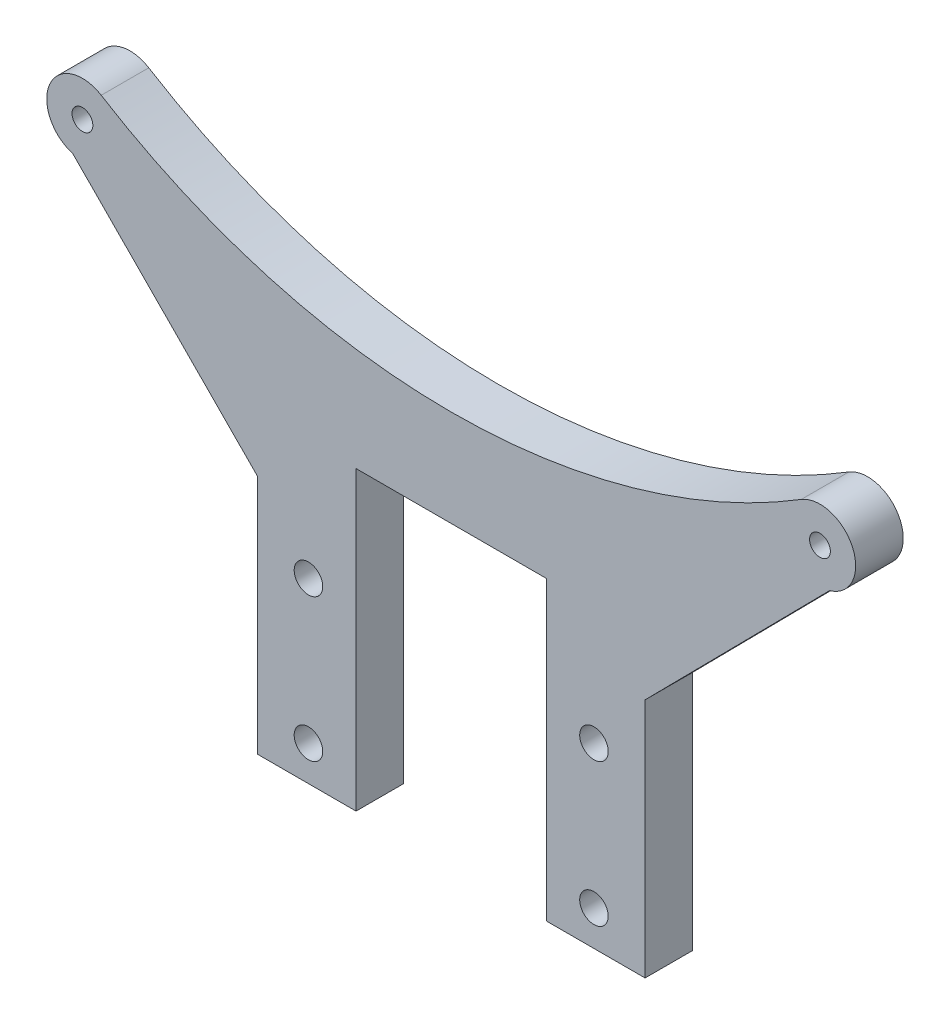
ISO-10303-21;
HEADER;
FILE_DESCRIPTION(('STEP AP214'),'2;1');
FILE_NAME('part.step','',(''),(''),'','','');
FILE_SCHEMA(('AUTOMOTIVE_DESIGN { 1 0 10303 214 1 1 1 1 }'));
ENDSEC;
DATA;
#1=APPLICATION_CONTEXT('core data for automotive mechanical design processes');
#2=APPLICATION_PROTOCOL_DEFINITION('international standard','automotive_design',2000,#1);
#3=PRODUCT_CONTEXT('',#1,'mechanical');
#4=PRODUCT('Part','Part','',(#3));
#5=PRODUCT_RELATED_PRODUCT_CATEGORY('part','',(#4));
#6=PRODUCT_DEFINITION_FORMATION('','',#4);
#7=PRODUCT_DEFINITION_CONTEXT('part definition',#1,'design');
#8=PRODUCT_DEFINITION('design','',#6,#7);
#9=PRODUCT_DEFINITION_SHAPE('','',#8);
#10=(LENGTH_UNIT() NAMED_UNIT(*) SI_UNIT(.MILLI.,.METRE.));
#11=(NAMED_UNIT(*) PLANE_ANGLE_UNIT() SI_UNIT($,.RADIAN.));
#12=(NAMED_UNIT(*) SI_UNIT($,.STERADIAN.) SOLID_ANGLE_UNIT());
#13=UNCERTAINTY_MEASURE_WITH_UNIT(LENGTH_MEASURE(1.E-05),#10,'distance_accuracy_value','');
#14=(GEOMETRIC_REPRESENTATION_CONTEXT(3) GLOBAL_UNCERTAINTY_ASSIGNED_CONTEXT((#13)) GLOBAL_UNIT_ASSIGNED_CONTEXT((#10,
#11,#12)) REPRESENTATION_CONTEXT('',''));
#15=CARTESIAN_POINT('',(0.,0.,0.));
#16=DIRECTION('',(0.,0.,1.));
#17=DIRECTION('',(1.,0.,0.));
#18=AXIS2_PLACEMENT_3D('',#15,#16,#17);
#19=CARTESIAN_POINT('',(-49.2125,22.0822111352801,6.35));
#20=DIRECTION('',(0.,0.,1.));
#21=DIRECTION('',(1.,0.,0.));
#22=AXIS2_PLACEMENT_3D('',#19,#20,#21);
#23=PLANE('',#22);
#24=CARTESIAN_POINT('',(19.05,-34.925,6.35));
#25=DIRECTION('',(0.,0.,1.));
#26=DIRECTION('',(-1.,0.,0.));
#27=AXIS2_PLACEMENT_3D('',#24,#25,#26);
#28=CIRCLE('',#27,1.90499999999999);
#29=CARTESIAN_POINT('',(17.145,-34.925,6.35));
#30=VERTEX_POINT('',#29);
#31=EDGE_CURVE('E299',#30,#30,#28,.T.);
#32=ORIENTED_EDGE('',*,*,#31,.F.);
#33=EDGE_LOOP('',(#32));
#34=FACE_BOUND('',#33,.T.);
#35=CARTESIAN_POINT('',(-49.2125,22.0822111352801,6.35));
#36=DIRECTION('',(0.,0.,1.));
#37=DIRECTION('',(1.,0.,0.));
#38=AXIS2_PLACEMENT_3D('',#35,#36,#37);
#39=CIRCLE('',#38,1.3890625);
#40=CARTESIAN_POINT('',(-47.8234375,22.0822111352801,6.35));
#41=VERTEX_POINT('',#40);
#42=EDGE_CURVE('E311',#41,#41,#39,.T.);
#43=ORIENTED_EDGE('',*,*,#42,.F.);
#44=EDGE_LOOP('',(#43));
#45=FACE_BOUND('',#44,.T.);
#46=CARTESIAN_POINT('',(-19.05,-15.875,6.35));
#47=DIRECTION('',(0.,0.,1.));
#48=DIRECTION('',(1.,0.,0.));
#49=AXIS2_PLACEMENT_3D('',#46,#47,#48);
#50=CIRCLE('',#49,1.905);
#51=CARTESIAN_POINT('',(-17.145,-15.875,6.35));
#52=VERTEX_POINT('',#51);
#53=EDGE_CURVE('E157',#52,#52,#50,.T.);
#54=ORIENTED_EDGE('',*,*,#53,.F.);
#55=EDGE_LOOP('',(#54));
#56=FACE_BOUND('',#55,.T.);
#57=DIRECTION('',(0.,1.,0.));
#58=VECTOR('',#57,1.);
#59=CARTESIAN_POINT('',(-12.7,0.,6.35));
#60=LINE('',#59,#58);
#61=CARTESIAN_POINT('',(-12.7,-39.5938606465336,6.35));
#62=VERTEX_POINT('',#61);
#63=CARTESIAN_POINT('',(-12.7,0.,6.35));
#64=VERTEX_POINT('',#63);
#65=EDGE_CURVE('E176',#62,#64,#60,.T.);
#66=ORIENTED_EDGE('',*,*,#65,.T.);
#67=DIRECTION('',(1.,0.,0.));
#68=VECTOR('',#67,1.);
#69=CARTESIAN_POINT('',(12.7,0.,6.35));
#70=LINE('',#69,#68);
#71=CARTESIAN_POINT('',(12.7,0.,6.35));
#72=VERTEX_POINT('',#71);
#73=EDGE_CURVE('E104',#64,#72,#70,.T.);
#74=ORIENTED_EDGE('',*,*,#73,.T.);
#75=DIRECTION('',(0.,-1.,0.));
#76=VECTOR('',#75,1.);
#77=CARTESIAN_POINT('',(12.7,0.,6.35));
#78=LINE('',#77,#76);
#79=CARTESIAN_POINT('',(12.7,-39.5938606465336,6.35));
#80=VERTEX_POINT('',#79);
#81=EDGE_CURVE('E203',#72,#80,#78,.T.);
#82=ORIENTED_EDGE('',*,*,#81,.T.);
#83=DIRECTION('',(1.,0.,0.));
#84=VECTOR('',#83,1.);
#85=CARTESIAN_POINT('',(12.7,-39.5938606465336,6.35));
#86=LINE('',#85,#84);
#87=CARTESIAN_POINT('',(25.8721633480755,-39.5938606465336,6.35));
#88=VERTEX_POINT('',#87);
#89=EDGE_CURVE('E222',#80,#88,#86,.T.);
#90=ORIENTED_EDGE('',*,*,#89,.T.);
#91=DIRECTION('',(0.,1.,0.));
#92=VECTOR('',#91,1.);
#93=CARTESIAN_POINT('',(25.8721633480755,-39.5938606465336,6.35));
#94=LINE('',#93,#92);
#95=CARTESIAN_POINT('',(25.8721633480755,-7.44555378006778,6.35));
#96=VERTEX_POINT('',#95);
#97=EDGE_CURVE('E219',#88,#96,#94,.T.);
#98=ORIENTED_EDGE('',*,*,#97,.T.);
#99=DIRECTION('',(0.702633802671898,0.711551642077248,0.));
#100=VECTOR('',#99,1.);
#101=CARTESIAN_POINT('',(25.8721633480755,-7.44555378006778,6.35));
#102=LINE('',#101,#100);
#103=CARTESIAN_POINT('',(50.5029869280307,17.4978846047434,6.35));
#104=VERTEX_POINT('',#103);
#105=EDGE_CURVE('E221',#96,#104,#102,.T.);
#106=ORIENTED_EDGE('',*,*,#105,.T.);
#107=CARTESIAN_POINT('',(49.2125,22.0822111352801,6.35));
#108=DIRECTION('',(0.,0.,1.));
#109=DIRECTION('',(-1.,0.,0.));
#110=AXIS2_PLACEMENT_3D('',#107,#108,#109);
#111=CIRCLE('',#110,4.76250000000001);
#112=CARTESIAN_POINT('',(46.7102658795886,26.134399514002,6.35));
#113=VERTEX_POINT('',#112);
#114=EDGE_CURVE('E224',#104,#113,#111,.T.);
#115=ORIENTED_EDGE('',*,*,#114,.T.);
#116=CARTESIAN_POINT('',(0.,101.778319089825,6.35));
#117=DIRECTION('',(0.,0.,-1.));
#118=DIRECTION('',(-1.,0.,0.));
#119=AXIS2_PLACEMENT_3D('',#116,#117,#118);
#120=CIRCLE('',#119,88.9036079545454);
#121=CARTESIAN_POINT('',(-46.7102658795886,26.134399514002,6.35));
#122=VERTEX_POINT('',#121);
#123=EDGE_CURVE('E230',#113,#122,#120,.T.);
#124=ORIENTED_EDGE('',*,*,#123,.T.);
#125=CARTESIAN_POINT('',(-49.2125,22.0822111352801,6.35));
#126=DIRECTION('',(0.,0.,1.));
#127=DIRECTION('',(1.,0.,0.));
#128=AXIS2_PLACEMENT_3D('',#125,#126,#127);
#129=CIRCLE('',#128,4.76250000000001);
#130=CARTESIAN_POINT('',(-50.5029869280307,17.4978846047434,6.35));
#131=VERTEX_POINT('',#130);
#132=EDGE_CURVE('E135',#122,#131,#129,.T.);
#133=ORIENTED_EDGE('',*,*,#132,.T.);
#134=DIRECTION('',(0.702633802671898,-0.711551642077248,0.));
#135=VECTOR('',#134,1.);
#136=CARTESIAN_POINT('',(-25.8721633480755,-7.44555378006778,6.35));
#137=LINE('',#136,#135);
#138=CARTESIAN_POINT('',(-25.8721633480755,-7.44555378006778,6.35));
#139=VERTEX_POINT('',#138);
#140=EDGE_CURVE('E129',#131,#139,#137,.T.);
#141=ORIENTED_EDGE('',*,*,#140,.T.);
#142=DIRECTION('',(0.,-1.,0.));
#143=VECTOR('',#142,1.);
#144=CARTESIAN_POINT('',(-25.8721633480755,-39.5938606465336,6.35));
#145=LINE('',#144,#143);
#146=CARTESIAN_POINT('',(-25.8721633480755,-39.5938606465336,6.35));
#147=VERTEX_POINT('',#146);
#148=EDGE_CURVE('E133',#139,#147,#145,.T.);
#149=ORIENTED_EDGE('',*,*,#148,.T.);
#150=DIRECTION('',(1.,0.,0.));
#151=VECTOR('',#150,1.);
#152=CARTESIAN_POINT('',(-12.7,-39.5938606465336,6.35));
#153=LINE('',#152,#151);
#154=EDGE_CURVE('E49',#147,#62,#153,.T.);
#155=ORIENTED_EDGE('',*,*,#154,.T.);
#156=EDGE_LOOP('',(#66,#74,#82,#90,#98,#106,#115,#124,#133,#141,#149,#155));
#157=FACE_BOUND('',#156,.T.);
#158=CARTESIAN_POINT('',(19.05,-15.875,6.35));
#159=DIRECTION('',(0.,0.,1.));
#160=DIRECTION('',(-1.,0.,0.));
#161=AXIS2_PLACEMENT_3D('',#158,#159,#160);
#162=CIRCLE('',#161,1.905);
#163=CARTESIAN_POINT('',(17.145,-15.875,6.35));
#164=VERTEX_POINT('',#163);
#165=EDGE_CURVE('E317',#164,#164,#162,.T.);
#166=ORIENTED_EDGE('',*,*,#165,.F.);
#167=EDGE_LOOP('',(#166));
#168=FACE_BOUND('',#167,.T.);
#169=CARTESIAN_POINT('',(-19.05,-34.925,6.35));
#170=DIRECTION('',(0.,0.,1.));
#171=DIRECTION('',(1.,0.,0.));
#172=AXIS2_PLACEMENT_3D('',#169,#170,#171);
#173=CIRCLE('',#172,1.905);
#174=CARTESIAN_POINT('',(-17.145,-34.925,6.35));
#175=VERTEX_POINT('',#174);
#176=EDGE_CURVE('E305',#175,#175,#173,.T.);
#177=ORIENTED_EDGE('',*,*,#176,.F.);
#178=EDGE_LOOP('',(#177));
#179=FACE_BOUND('',#178,.T.);
#180=CARTESIAN_POINT('',(49.2125,22.0822111352801,6.35));
#181=DIRECTION('',(0.,0.,1.));
#182=DIRECTION('',(-1.,0.,0.));
#183=AXIS2_PLACEMENT_3D('',#180,#181,#182);
#184=CIRCLE('',#183,1.3890625);
#185=CARTESIAN_POINT('',(47.8234375,22.0822111352801,6.35));
#186=VERTEX_POINT('',#185);
#187=EDGE_CURVE('E290',#186,#186,#184,.T.);
#188=ORIENTED_EDGE('',*,*,#187,.F.);
#189=EDGE_LOOP('',(#188));
#190=FACE_BOUND('',#189,.T.);
#191=ADVANCED_FACE('F32',(#34,#45,#56,#157,#168,#179,#190),#23,.T.);
#192=CARTESIAN_POINT('',(-49.2125,22.0822111352801,0.));
#193=DIRECTION('',(0.,0.,1.));
#194=DIRECTION('',(1.,0.,0.));
#195=AXIS2_PLACEMENT_3D('',#192,#193,#194);
#196=PLANE('',#195);
#197=CARTESIAN_POINT('',(19.05,-34.925,0.));
#198=DIRECTION('',(0.,0.,1.));
#199=DIRECTION('',(-1.,0.,0.));
#200=AXIS2_PLACEMENT_3D('',#197,#198,#199);
#201=CIRCLE('',#200,1.90499999999999);
#202=CARTESIAN_POINT('',(17.145,-34.925,0.));
#203=VERTEX_POINT('',#202);
#204=EDGE_CURVE('E296',#203,#203,#201,.T.);
#205=ORIENTED_EDGE('',*,*,#204,.T.);
#206=EDGE_LOOP('',(#205));
#207=FACE_BOUND('',#206,.T.);
#208=CARTESIAN_POINT('',(-49.2125,22.0822111352801,0.));
#209=DIRECTION('',(0.,0.,1.));
#210=DIRECTION('',(1.,0.,0.));
#211=AXIS2_PLACEMENT_3D('',#208,#209,#210);
#212=CIRCLE('',#211,1.3890625);
#213=CARTESIAN_POINT('',(-47.8234375,22.0822111352801,0.));
#214=VERTEX_POINT('',#213);
#215=EDGE_CURVE('E308',#214,#214,#212,.T.);
#216=ORIENTED_EDGE('',*,*,#215,.T.);
#217=EDGE_LOOP('',(#216));
#218=FACE_BOUND('',#217,.T.);
#219=CARTESIAN_POINT('',(-19.05,-15.875,0.));
#220=DIRECTION('',(0.,0.,1.));
#221=DIRECTION('',(1.,0.,0.));
#222=AXIS2_PLACEMENT_3D('',#219,#220,#221);
#223=CIRCLE('',#222,1.905);
#224=CARTESIAN_POINT('',(-17.145,-15.875,0.));
#225=VERTEX_POINT('',#224);
#226=EDGE_CURVE('E320',#225,#225,#223,.T.);
#227=ORIENTED_EDGE('',*,*,#226,.T.);
#228=EDGE_LOOP('',(#227));
#229=FACE_BOUND('',#228,.T.);
#230=DIRECTION('',(0.,1.,0.));
#231=VECTOR('',#230,1.);
#232=CARTESIAN_POINT('',(-12.7,0.,0.));
#233=LINE('',#232,#231);
#234=CARTESIAN_POINT('',(-12.7,-39.5938606465336,0.));
#235=VERTEX_POINT('',#234);
#236=CARTESIAN_POINT('',(-12.7,0.,0.));
#237=VERTEX_POINT('',#236);
#238=EDGE_CURVE('E153',#235,#237,#233,.T.);
#239=ORIENTED_EDGE('',*,*,#238,.F.);
#240=DIRECTION('',(1.,0.,0.));
#241=VECTOR('',#240,1.);
#242=CARTESIAN_POINT('',(-12.7,-39.5938606465336,0.));
#243=LINE('',#242,#241);
#244=CARTESIAN_POINT('',(-25.8721633480755,-39.5938606465336,0.));
#245=VERTEX_POINT('',#244);
#246=EDGE_CURVE('E96',#245,#235,#243,.T.);
#247=ORIENTED_EDGE('',*,*,#246,.F.);
#248=DIRECTION('',(0.,-1.,0.));
#249=VECTOR('',#248,1.);
#250=CARTESIAN_POINT('',(-25.8721633480755,-39.5938606465336,0.));
#251=LINE('',#250,#249);
#252=CARTESIAN_POINT('',(-25.8721633480755,-7.44555378006778,0.));
#253=VERTEX_POINT('',#252);
#254=EDGE_CURVE('E90',#253,#245,#251,.T.);
#255=ORIENTED_EDGE('',*,*,#254,.F.);
#256=DIRECTION('',(0.702633802671898,-0.711551642077248,0.));
#257=VECTOR('',#256,1.);
#258=CARTESIAN_POINT('',(-25.8721633480755,-7.44555378006778,0.));
#259=LINE('',#258,#257);
#260=CARTESIAN_POINT('',(-50.5029869280307,17.4978846047434,0.));
#261=VERTEX_POINT('',#260);
#262=EDGE_CURVE('E143',#261,#253,#259,.T.);
#263=ORIENTED_EDGE('',*,*,#262,.F.);
#264=CARTESIAN_POINT('',(-49.2125,22.0822111352801,0.));
#265=DIRECTION('',(0.,0.,1.));
#266=DIRECTION('',(1.,0.,0.));
#267=AXIS2_PLACEMENT_3D('',#264,#265,#266);
#268=CIRCLE('',#267,4.76250000000001);
#269=CARTESIAN_POINT('',(-46.7102658795886,26.134399514002,0.));
#270=VERTEX_POINT('',#269);
#271=EDGE_CURVE('E171',#270,#261,#268,.T.);
#272=ORIENTED_EDGE('',*,*,#271,.F.);
#273=CARTESIAN_POINT('',(0.,101.778319089825,0.));
#274=DIRECTION('',(0.,0.,-1.));
#275=DIRECTION('',(-1.,0.,0.));
#276=AXIS2_PLACEMENT_3D('',#273,#274,#275);
#277=CIRCLE('',#276,88.9036079545454);
#278=CARTESIAN_POINT('',(46.7102658795886,26.134399514002,0.));
#279=VERTEX_POINT('',#278);
#280=EDGE_CURVE('E169',#279,#270,#277,.T.);
#281=ORIENTED_EDGE('',*,*,#280,.F.);
#282=CARTESIAN_POINT('',(49.2125,22.0822111352801,0.));
#283=DIRECTION('',(0.,0.,1.));
#284=DIRECTION('',(-1.,0.,0.));
#285=AXIS2_PLACEMENT_3D('',#282,#283,#284);
#286=CIRCLE('',#285,4.76250000000001);
#287=CARTESIAN_POINT('',(50.5029869280307,17.4978846047434,0.));
#288=VERTEX_POINT('',#287);
#289=EDGE_CURVE('E167',#288,#279,#286,.T.);
#290=ORIENTED_EDGE('',*,*,#289,.F.);
#291=DIRECTION('',(0.702633802671898,0.711551642077248,0.));
#292=VECTOR('',#291,1.);
#293=CARTESIAN_POINT('',(25.8721633480755,-7.44555378006778,0.));
#294=LINE('',#293,#292);
#295=CARTESIAN_POINT('',(25.8721633480755,-7.44555378006778,0.));
#296=VERTEX_POINT('',#295);
#297=EDGE_CURVE('E165',#296,#288,#294,.T.);
#298=ORIENTED_EDGE('',*,*,#297,.F.);
#299=DIRECTION('',(0.,1.,0.));
#300=VECTOR('',#299,1.);
#301=CARTESIAN_POINT('',(25.8721633480755,-39.5938606465336,0.));
#302=LINE('',#301,#300);
#303=CARTESIAN_POINT('',(25.8721633480755,-39.5938606465336,0.));
#304=VERTEX_POINT('',#303);
#305=EDGE_CURVE('E163',#304,#296,#302,.T.);
#306=ORIENTED_EDGE('',*,*,#305,.F.);
#307=DIRECTION('',(1.,0.,0.));
#308=VECTOR('',#307,1.);
#309=CARTESIAN_POINT('',(12.7,-39.5938606465336,0.));
#310=LINE('',#309,#308);
#311=CARTESIAN_POINT('',(12.7,-39.5938606465336,0.));
#312=VERTEX_POINT('',#311);
#313=EDGE_CURVE('E161',#312,#304,#310,.T.);
#314=ORIENTED_EDGE('',*,*,#313,.F.);
#315=DIRECTION('',(0.,-1.,0.));
#316=VECTOR('',#315,1.);
#317=CARTESIAN_POINT('',(12.7,0.,0.));
#318=LINE('',#317,#316);
#319=CARTESIAN_POINT('',(12.7,0.,0.));
#320=VERTEX_POINT('',#319);
#321=EDGE_CURVE('E159',#320,#312,#318,.T.);
#322=ORIENTED_EDGE('',*,*,#321,.F.);
#323=DIRECTION('',(1.,0.,0.));
#324=VECTOR('',#323,1.);
#325=CARTESIAN_POINT('',(12.7,0.,0.));
#326=LINE('',#325,#324);
#327=EDGE_CURVE('E156',#237,#320,#326,.T.);
#328=ORIENTED_EDGE('',*,*,#327,.F.);
#329=EDGE_LOOP('',(#239,#247,#255,#263,#272,#281,#290,#298,#306,#314,#322,#328));
#330=FACE_BOUND('',#329,.T.);
#331=CARTESIAN_POINT('',(19.05,-15.875,0.));
#332=DIRECTION('',(0.,0.,1.));
#333=DIRECTION('',(-1.,0.,0.));
#334=AXIS2_PLACEMENT_3D('',#331,#332,#333);
#335=CIRCLE('',#334,1.905);
#336=CARTESIAN_POINT('',(17.145,-15.875,0.));
#337=VERTEX_POINT('',#336);
#338=EDGE_CURVE('E314',#337,#337,#335,.T.);
#339=ORIENTED_EDGE('',*,*,#338,.T.);
#340=EDGE_LOOP('',(#339));
#341=FACE_BOUND('',#340,.T.);
#342=CARTESIAN_POINT('',(-19.05,-34.925,0.));
#343=DIRECTION('',(0.,0.,1.));
#344=DIRECTION('',(1.,0.,0.));
#345=AXIS2_PLACEMENT_3D('',#342,#343,#344);
#346=CIRCLE('',#345,1.905);
#347=CARTESIAN_POINT('',(-17.145,-34.925,0.));
#348=VERTEX_POINT('',#347);
#349=EDGE_CURVE('E302',#348,#348,#346,.T.);
#350=ORIENTED_EDGE('',*,*,#349,.T.);
#351=EDGE_LOOP('',(#350));
#352=FACE_BOUND('',#351,.T.);
#353=CARTESIAN_POINT('',(49.2125,22.0822111352801,0.));
#354=DIRECTION('',(0.,0.,1.));
#355=DIRECTION('',(-1.,0.,0.));
#356=AXIS2_PLACEMENT_3D('',#353,#354,#355);
#357=CIRCLE('',#356,1.3890625);
#358=CARTESIAN_POINT('',(47.8234375,22.0822111352801,0.));
#359=VERTEX_POINT('',#358);
#360=EDGE_CURVE('E293',#359,#359,#357,.T.);
#361=ORIENTED_EDGE('',*,*,#360,.T.);
#362=EDGE_LOOP('',(#361));
#363=FACE_BOUND('',#362,.T.);
#364=ADVANCED_FACE('F207',(#207,#218,#229,#330,#341,#352,#363),#196,.F.);
#365=CARTESIAN_POINT('',(-12.7,0.,6.35));
#366=DIRECTION('',(-1.,0.,0.));
#367=DIRECTION('',(0.,0.,1.));
#368=AXIS2_PLACEMENT_3D('',#365,#366,#367);
#369=PLANE('',#368);
#370=ORIENTED_EDGE('',*,*,#238,.T.);
#371=DIRECTION('',(0.,0.,-1.));
#372=VECTOR('',#371,1.);
#373=CARTESIAN_POINT('',(-12.7,0.,6.35));
#374=LINE('',#373,#372);
#375=EDGE_CURVE('E11',#64,#237,#374,.T.);
#376=ORIENTED_EDGE('',*,*,#375,.F.);
#377=ORIENTED_EDGE('',*,*,#65,.F.);
#378=DIRECTION('',(0.,0.,-1.));
#379=VECTOR('',#378,1.);
#380=CARTESIAN_POINT('',(-12.7,-39.5938606465336,6.35));
#381=LINE('',#380,#379);
#382=EDGE_CURVE('E149',#62,#235,#381,.T.);
#383=ORIENTED_EDGE('',*,*,#382,.T.);
#384=EDGE_LOOP('',(#370,#376,#377,#383));
#385=FACE_BOUND('',#384,.T.);
#386=ADVANCED_FACE('F34',(#385),#369,.F.);
#387=CARTESIAN_POINT('',(12.7,0.,6.35));
#388=DIRECTION('',(0.,1.,0.));
#389=DIRECTION('',(-1.,0.,0.));
#390=AXIS2_PLACEMENT_3D('',#387,#388,#389);
#391=PLANE('',#390);
#392=ORIENTED_EDGE('',*,*,#327,.T.);
#393=DIRECTION('',(0.,0.,-1.));
#394=VECTOR('',#393,1.);
#395=CARTESIAN_POINT('',(12.7,0.,6.35));
#396=LINE('',#395,#394);
#397=EDGE_CURVE('E41',#72,#320,#396,.T.);
#398=ORIENTED_EDGE('',*,*,#397,.F.);
#399=ORIENTED_EDGE('',*,*,#73,.F.);
#400=ORIENTED_EDGE('',*,*,#375,.T.);
#401=EDGE_LOOP('',(#392,#398,#399,#400));
#402=FACE_BOUND('',#401,.T.);
#403=ADVANCED_FACE('F447',(#402),#391,.F.);
#404=CARTESIAN_POINT('',(12.7,0.,6.35));
#405=DIRECTION('',(1.,0.,0.));
#406=DIRECTION('',(0.,0.,-1.));
#407=AXIS2_PLACEMENT_3D('',#404,#405,#406);
#408=PLANE('',#407);
#409=ORIENTED_EDGE('',*,*,#321,.T.);
#410=DIRECTION('',(0.,0.,-1.));
#411=VECTOR('',#410,1.);
#412=CARTESIAN_POINT('',(12.7,-39.5938606465336,6.35));
#413=LINE('',#412,#411);
#414=EDGE_CURVE('E195',#80,#312,#413,.T.);
#415=ORIENTED_EDGE('',*,*,#414,.F.);
#416=ORIENTED_EDGE('',*,*,#81,.F.);
#417=ORIENTED_EDGE('',*,*,#397,.T.);
#418=EDGE_LOOP('',(#409,#415,#416,#417));
#419=FACE_BOUND('',#418,.T.);
#420=ADVANCED_FACE('F201',(#419),#408,.F.);
#421=CARTESIAN_POINT('',(12.7,-39.5938606465336,6.35));
#422=DIRECTION('',(0.,1.,0.));
#423=DIRECTION('',(0.,0.,1.));
#424=AXIS2_PLACEMENT_3D('',#421,#422,#423);
#425=PLANE('',#424);
#426=ORIENTED_EDGE('',*,*,#313,.T.);
#427=DIRECTION('',(0.,0.,-1.));
#428=VECTOR('',#427,1.);
#429=CARTESIAN_POINT('',(25.8721633480755,-39.5938606465336,6.35));
#430=LINE('',#429,#428);
#431=EDGE_CURVE('E192',#88,#304,#430,.T.);
#432=ORIENTED_EDGE('',*,*,#431,.F.);
#433=ORIENTED_EDGE('',*,*,#89,.F.);
#434=ORIENTED_EDGE('',*,*,#414,.T.);
#435=EDGE_LOOP('',(#426,#432,#433,#434));
#436=FACE_BOUND('',#435,.T.);
#437=ADVANCED_FACE('F213',(#436),#425,.F.);
#438=CARTESIAN_POINT('',(25.8721633480755,-39.5938606465336,6.35));
#439=DIRECTION('',(-1.,0.,0.));
#440=DIRECTION('',(0.,0.,1.));
#441=AXIS2_PLACEMENT_3D('',#438,#439,#440);
#442=PLANE('',#441);
#443=ORIENTED_EDGE('',*,*,#305,.T.);
#444=DIRECTION('',(0.,0.,-1.));
#445=VECTOR('',#444,1.);
#446=CARTESIAN_POINT('',(25.8721633480755,-7.44555378006778,6.35));
#447=LINE('',#446,#445);
#448=EDGE_CURVE('E189',#96,#296,#447,.T.);
#449=ORIENTED_EDGE('',*,*,#448,.F.);
#450=ORIENTED_EDGE('',*,*,#97,.F.);
#451=ORIENTED_EDGE('',*,*,#431,.T.);
#452=EDGE_LOOP('',(#443,#449,#450,#451));
#453=FACE_BOUND('',#452,.T.);
#454=ADVANCED_FACE('F217',(#453),#442,.F.);
#455=CARTESIAN_POINT('',(25.8721633480755,-7.44555378006778,6.35));
#456=DIRECTION('',(-0.711551642077248,0.702633802671898,0.));
#457=DIRECTION('',(-0.702633802671898,-0.711551642077248,0.));
#458=AXIS2_PLACEMENT_3D('',#455,#456,#457);
#459=PLANE('',#458);
#460=ORIENTED_EDGE('',*,*,#297,.T.);
#461=DIRECTION('',(0.,0.,-1.));
#462=VECTOR('',#461,1.);
#463=CARTESIAN_POINT('',(50.5029869280307,17.4978846047434,6.35));
#464=LINE('',#463,#462);
#465=EDGE_CURVE('E186',#104,#288,#464,.T.);
#466=ORIENTED_EDGE('',*,*,#465,.F.);
#467=ORIENTED_EDGE('',*,*,#105,.F.);
#468=ORIENTED_EDGE('',*,*,#448,.T.);
#469=EDGE_LOOP('',(#460,#466,#467,#468));
#470=FACE_BOUND('',#469,.T.);
#471=ADVANCED_FACE('F412',(#470),#459,.F.);
#472=CARTESIAN_POINT('',(49.2125,22.0822111352801,6.35));
#473=DIRECTION('',(0.,0.,-1.));
#474=DIRECTION('',(-1.,0.,0.));
#475=AXIS2_PLACEMENT_3D('',#472,#473,#474);
#476=CYLINDRICAL_SURFACE('',#475,4.76250000000001);
#477=ORIENTED_EDGE('',*,*,#289,.T.);
#478=DIRECTION('',(0.,0.,-1.));
#479=VECTOR('',#478,1.);
#480=CARTESIAN_POINT('',(46.7102658795886,26.134399514002,6.35));
#481=LINE('',#480,#479);
#482=EDGE_CURVE('E183',#113,#279,#481,.T.);
#483=ORIENTED_EDGE('',*,*,#482,.F.);
#484=ORIENTED_EDGE('',*,*,#114,.F.);
#485=ORIENTED_EDGE('',*,*,#465,.T.);
#486=EDGE_LOOP('',(#477,#483,#484,#485));
#487=FACE_BOUND('',#486,.T.);
#488=ADVANCED_FACE('F403',(#487),#476,.T.);
#489=CARTESIAN_POINT('',(0.,101.778319089825,6.35));
#490=DIRECTION('',(0.,0.,-1.));
#491=DIRECTION('',(-1.,0.,0.));
#492=AXIS2_PLACEMENT_3D('',#489,#490,#491);
#493=CYLINDRICAL_SURFACE('',#492,88.9036079545454);
#494=ORIENTED_EDGE('',*,*,#280,.T.);
#495=DIRECTION('',(0.,0.,-1.));
#496=VECTOR('',#495,1.);
#497=CARTESIAN_POINT('',(-46.7102658795886,26.134399514002,6.35));
#498=LINE('',#497,#496);
#499=EDGE_CURVE('E180',#122,#270,#498,.T.);
#500=ORIENTED_EDGE('',*,*,#499,.F.);
#501=ORIENTED_EDGE('',*,*,#123,.F.);
#502=ORIENTED_EDGE('',*,*,#482,.T.);
#503=EDGE_LOOP('',(#494,#500,#501,#502));
#504=FACE_BOUND('',#503,.T.);
#505=ADVANCED_FACE('F236',(#504),#493,.F.);
#506=CARTESIAN_POINT('',(-49.2125,22.0822111352801,6.35));
#507=DIRECTION('',(0.,0.,-1.));
#508=DIRECTION('',(-1.,0.,0.));
#509=AXIS2_PLACEMENT_3D('',#506,#507,#508);
#510=CYLINDRICAL_SURFACE('',#509,4.76250000000001);
#511=ORIENTED_EDGE('',*,*,#271,.T.);
#512=DIRECTION('',(0.,0.,-1.));
#513=VECTOR('',#512,1.);
#514=CARTESIAN_POINT('',(-50.5029869280307,17.4978846047434,6.35));
#515=LINE('',#514,#513);
#516=EDGE_CURVE('E144',#131,#261,#515,.T.);
#517=ORIENTED_EDGE('',*,*,#516,.F.);
#518=ORIENTED_EDGE('',*,*,#132,.F.);
#519=ORIENTED_EDGE('',*,*,#499,.T.);
#520=EDGE_LOOP('',(#511,#517,#518,#519));
#521=FACE_BOUND('',#520,.T.);
#522=ADVANCED_FACE('F240',(#521),#510,.T.);
#523=CARTESIAN_POINT('',(-25.8721633480755,-7.44555378006778,6.35));
#524=DIRECTION('',(0.711551642077248,0.702633802671898,0.));
#525=DIRECTION('',(-0.702633802671898,0.711551642077248,0.));
#526=AXIS2_PLACEMENT_3D('',#523,#524,#525);
#527=PLANE('',#526);
#528=ORIENTED_EDGE('',*,*,#262,.T.);
#529=DIRECTION('',(0.,0.,-1.));
#530=VECTOR('',#529,1.);
#531=CARTESIAN_POINT('',(-25.8721633480755,-7.44555378006778,6.35));
#532=LINE('',#531,#530);
#533=EDGE_CURVE('E140',#139,#253,#532,.T.);
#534=ORIENTED_EDGE('',*,*,#533,.F.);
#535=ORIENTED_EDGE('',*,*,#140,.F.);
#536=ORIENTED_EDGE('',*,*,#516,.T.);
#537=EDGE_LOOP('',(#528,#534,#535,#536));
#538=FACE_BOUND('',#537,.T.);
#539=ADVANCED_FACE('F141',(#538),#527,.F.);
#540=CARTESIAN_POINT('',(-25.8721633480755,-39.5938606465336,6.35));
#541=DIRECTION('',(1.,0.,0.));
#542=DIRECTION('',(0.,0.,-1.));
#543=AXIS2_PLACEMENT_3D('',#540,#541,#542);
#544=PLANE('',#543);
#545=ORIENTED_EDGE('',*,*,#254,.T.);
#546=DIRECTION('',(0.,0.,-1.));
#547=VECTOR('',#546,1.);
#548=CARTESIAN_POINT('',(-25.8721633480755,-39.5938606465336,6.35));
#549=LINE('',#548,#547);
#550=EDGE_CURVE('E145',#147,#245,#549,.T.);
#551=ORIENTED_EDGE('',*,*,#550,.F.);
#552=ORIENTED_EDGE('',*,*,#148,.F.);
#553=ORIENTED_EDGE('',*,*,#533,.T.);
#554=EDGE_LOOP('',(#545,#551,#552,#553));
#555=FACE_BOUND('',#554,.T.);
#556=ADVANCED_FACE('F147',(#555),#544,.F.);
#557=CARTESIAN_POINT('',(-12.7,-39.5938606465336,6.35));
#558=DIRECTION('',(0.,1.,0.));
#559=DIRECTION('',(0.,0.,1.));
#560=AXIS2_PLACEMENT_3D('',#557,#558,#559);
#561=PLANE('',#560);
#562=ORIENTED_EDGE('',*,*,#246,.T.);
#563=ORIENTED_EDGE('',*,*,#382,.F.);
#564=ORIENTED_EDGE('',*,*,#154,.F.);
#565=ORIENTED_EDGE('',*,*,#550,.T.);
#566=EDGE_LOOP('',(#562,#563,#564,#565));
#567=FACE_BOUND('',#566,.T.);
#568=ADVANCED_FACE('F244',(#567),#561,.F.);
#569=CARTESIAN_POINT('',(-19.05,-15.875,6.35));
#570=DIRECTION('',(0.,0.,-1.));
#571=DIRECTION('',(-1.,0.,0.));
#572=AXIS2_PLACEMENT_3D('',#569,#570,#571);
#573=CYLINDRICAL_SURFACE('',#572,1.905);
#574=ORIENTED_EDGE('',*,*,#53,.T.);
#575=EDGE_LOOP('',(#574));
#576=FACE_BOUND('',#575,.T.);
#577=ORIENTED_EDGE('',*,*,#226,.F.);
#578=EDGE_LOOP('',(#577));
#579=FACE_BOUND('',#578,.T.);
#580=ADVANCED_FACE('F246',(#576,#579),#573,.F.);
#581=CARTESIAN_POINT('',(19.05,-15.875,6.35));
#582=DIRECTION('',(0.,0.,-1.));
#583=DIRECTION('',(-1.,0.,0.));
#584=AXIS2_PLACEMENT_3D('',#581,#582,#583);
#585=CYLINDRICAL_SURFACE('',#584,1.905);
#586=ORIENTED_EDGE('',*,*,#165,.T.);
#587=EDGE_LOOP('',(#586));
#588=FACE_BOUND('',#587,.T.);
#589=ORIENTED_EDGE('',*,*,#338,.F.);
#590=EDGE_LOOP('',(#589));
#591=FACE_BOUND('',#590,.T.);
#592=ADVANCED_FACE('F252',(#588,#591),#585,.F.);
#593=CARTESIAN_POINT('',(-49.2125,22.0822111352801,6.35));
#594=DIRECTION('',(0.,0.,-1.));
#595=DIRECTION('',(-1.,0.,0.));
#596=AXIS2_PLACEMENT_3D('',#593,#594,#595);
#597=CYLINDRICAL_SURFACE('',#596,1.3890625);
#598=ORIENTED_EDGE('',*,*,#42,.T.);
#599=EDGE_LOOP('',(#598));
#600=FACE_BOUND('',#599,.T.);
#601=ORIENTED_EDGE('',*,*,#215,.F.);
#602=EDGE_LOOP('',(#601));
#603=FACE_BOUND('',#602,.T.);
#604=ADVANCED_FACE('F269',(#600,#603),#597,.F.);
#605=CARTESIAN_POINT('',(-19.05,-34.925,6.35));
#606=DIRECTION('',(0.,0.,-1.));
#607=DIRECTION('',(-1.,0.,0.));
#608=AXIS2_PLACEMENT_3D('',#605,#606,#607);
#609=CYLINDRICAL_SURFACE('',#608,1.905);
#610=ORIENTED_EDGE('',*,*,#176,.T.);
#611=EDGE_LOOP('',(#610));
#612=FACE_BOUND('',#611,.T.);
#613=ORIENTED_EDGE('',*,*,#349,.F.);
#614=EDGE_LOOP('',(#613));
#615=FACE_BOUND('',#614,.T.);
#616=ADVANCED_FACE('F273',(#612,#615),#609,.F.);
#617=CARTESIAN_POINT('',(19.05,-34.925,6.35));
#618=DIRECTION('',(0.,0.,-1.));
#619=DIRECTION('',(-1.,0.,0.));
#620=AXIS2_PLACEMENT_3D('',#617,#618,#619);
#621=CYLINDRICAL_SURFACE('',#620,1.90499999999999);
#622=ORIENTED_EDGE('',*,*,#31,.T.);
#623=EDGE_LOOP('',(#622));
#624=FACE_BOUND('',#623,.T.);
#625=ORIENTED_EDGE('',*,*,#204,.F.);
#626=EDGE_LOOP('',(#625));
#627=FACE_BOUND('',#626,.T.);
#628=ADVANCED_FACE('F277',(#624,#627),#621,.F.);
#629=CARTESIAN_POINT('',(49.2125,22.0822111352801,6.35));
#630=DIRECTION('',(0.,0.,-1.));
#631=DIRECTION('',(-1.,0.,0.));
#632=AXIS2_PLACEMENT_3D('',#629,#630,#631);
#633=CYLINDRICAL_SURFACE('',#632,1.3890625);
#634=ORIENTED_EDGE('',*,*,#187,.T.);
#635=EDGE_LOOP('',(#634));
#636=FACE_BOUND('',#635,.T.);
#637=ORIENTED_EDGE('',*,*,#360,.F.);
#638=EDGE_LOOP('',(#637));
#639=FACE_BOUND('',#638,.T.);
#640=ADVANCED_FACE('F281',(#636,#639),#633,.F.);
#641=CLOSED_SHELL('',(#191,#364,#386,#403,#420,#437,#454,#471,#488,#505,#522,#539,#556,#568,
#580,#592,#604,#616,#628,#640));
#642=MANIFOLD_SOLID_BREP('B2',#641);
#643=ADVANCED_BREP_SHAPE_REPRESENTATION('',(#18,#642),#14);
#644=SHAPE_DEFINITION_REPRESENTATION(#9,#643);
ENDSEC;
END-ISO-10303-21;
